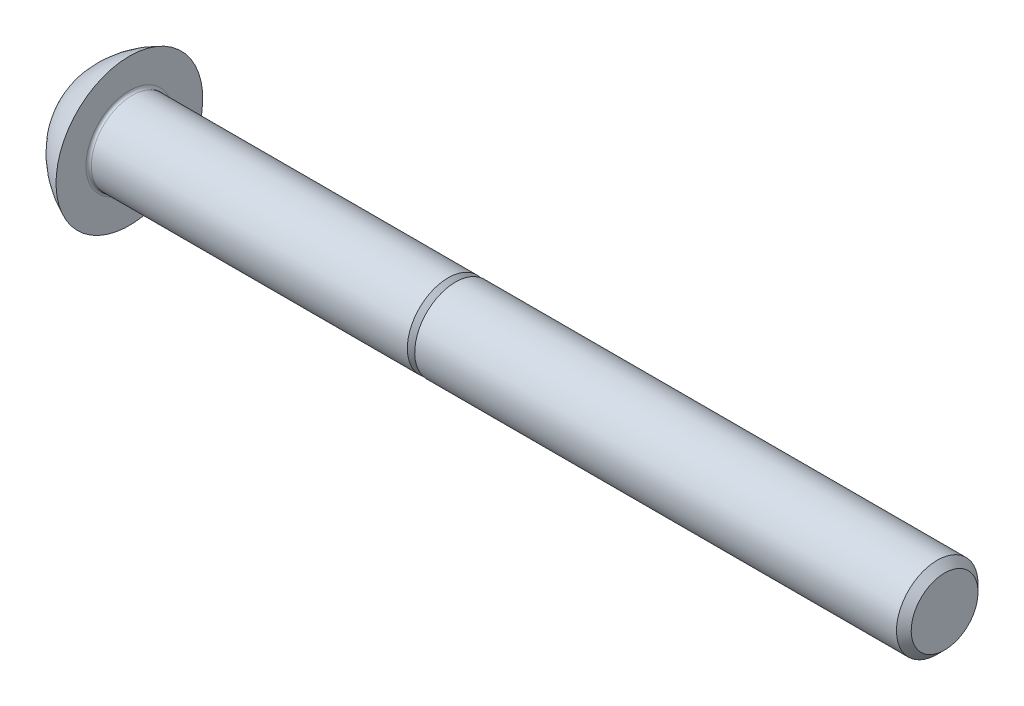
ISO-10303-21;
HEADER;
FILE_DESCRIPTION(('STEP AP214'),'2;1');
FILE_NAME('part.step','',(''),(''),'','','');
FILE_SCHEMA(('AUTOMOTIVE_DESIGN { 1 0 10303 214 1 1 1 1 }'));
ENDSEC;
DATA;
#1=APPLICATION_CONTEXT('core data for automotive mechanical design processes');
#2=APPLICATION_PROTOCOL_DEFINITION('international standard','automotive_design',2000,#1);
#3=PRODUCT_CONTEXT('',#1,'mechanical');
#4=PRODUCT('Part','Part','',(#3));
#5=PRODUCT_RELATED_PRODUCT_CATEGORY('part','',(#4));
#6=PRODUCT_DEFINITION_FORMATION('','',#4);
#7=PRODUCT_DEFINITION_CONTEXT('part definition',#1,'design');
#8=PRODUCT_DEFINITION('design','',#6,#7);
#9=PRODUCT_DEFINITION_SHAPE('','',#8);
#10=(LENGTH_UNIT() NAMED_UNIT(*) SI_UNIT(.MILLI.,.METRE.));
#11=(NAMED_UNIT(*) PLANE_ANGLE_UNIT() SI_UNIT($,.RADIAN.));
#12=(NAMED_UNIT(*) SI_UNIT($,.STERADIAN.) SOLID_ANGLE_UNIT());
#13=UNCERTAINTY_MEASURE_WITH_UNIT(LENGTH_MEASURE(1.E-05),#10,'distance_accuracy_value','');
#14=(GEOMETRIC_REPRESENTATION_CONTEXT(3) GLOBAL_UNCERTAINTY_ASSIGNED_CONTEXT((#13)) GLOBAL_UNIT_ASSIGNED_CONTEXT((#10,
#11,#12)) REPRESENTATION_CONTEXT('',''));
#15=CARTESIAN_POINT('',(0.,0.,0.));
#16=DIRECTION('',(0.,0.,1.));
#17=DIRECTION('',(1.,0.,0.));
#18=AXIS2_PLACEMENT_3D('',#15,#16,#17);
#19=CARTESIAN_POINT('',(-1.,-0.900666419935816,0.52));
#20=DIRECTION('',(0.,-0.866025403784439,0.5));
#21=DIRECTION('',(0.,-0.5,-0.866025403784439));
#22=AXIS2_PLACEMENT_3D('',#19,#20,#21);
#23=PLANE('',#22);
#24=DIRECTION('',(0.,-0.5,-0.866025403784439));
#25=VECTOR('',#24,1.);
#26=CARTESIAN_POINT('',(0.,-0.819416419935816,0.660729128114971));
#27=LINE('',#26,#25);
#28=CARTESIAN_POINT('',(0.,-0.600444279957211,1.04));
#29=VERTEX_POINT('',#28);
#30=CARTESIAN_POINT('',(0.,-1.20088855991442,0.));
#31=VERTEX_POINT('',#30);
#32=EDGE_CURVE('E37',#29,#31,#27,.T.);
#33=ORIENTED_EDGE('',*,*,#32,.F.);
#34=DIRECTION('',(1.,0.,0.));
#35=VECTOR('',#34,1.);
#36=CARTESIAN_POINT('',(-1.,-0.600444279957211,1.04));
#37=LINE('',#36,#35);
#38=CARTESIAN_POINT('',(1.04,-0.600444279957211,1.04));
#39=VERTEX_POINT('',#38);
#40=EDGE_CURVE('E11',#29,#39,#37,.T.);
#41=ORIENTED_EDGE('',*,*,#40,.T.);
#42=DIRECTION('',(0.,0.5,0.866025403784439));
#43=VECTOR('',#42,1.);
#44=CARTESIAN_POINT('',(1.04,-0.600444279957211,1.04));
#45=LINE('',#44,#43);
#46=CARTESIAN_POINT('',(1.04,-0.752876240745874,0.775980099216687));
#47=VERTEX_POINT('',#46);
#48=EDGE_CURVE('E213',#47,#39,#45,.T.);
#49=ORIENTED_EDGE('',*,*,#48,.F.);
#50=CARTESIAN_POINT('',(1.04,-0.752876240745875,0.775980099216688));
#51=CARTESIAN_POINT('',(1.03905947423286,-0.74357721040589,0.792086492226667));
#52=CARTESIAN_POINT('',(1.038,-0.73418518976256,0.808353949166648));
#53=(BOUNDED_CURVE() B_SPLINE_CURVE(2,(#50,#51,#52),.UNSPECIFIED.,.F.,
.F.) B_SPLINE_CURVE_WITH_KNOTS((3,3),(0.,0.0374356048378607),
.UNSPECIFIED.) CURVE() GEOMETRIC_REPRESENTATION_ITEM() RATIONAL_B_SPLINE_CURVE((1.,
1.00014797863071,1.)) REPRESENTATION_ITEM(''));
#54=CARTESIAN_POINT('',(1.038,-0.734185189762562,0.808353949166645));
#55=VERTEX_POINT('',#54);
#56=EDGE_CURVE('E29',#47,#55,#53,.T.);
#57=ORIENTED_EDGE('',*,*,#56,.T.);
#58=DIRECTION('',(0.,-0.5,-0.866025403784439));
#59=VECTOR('',#58,1.);
#60=CARTESIAN_POINT('',(1.038,-0.832416419935816,0.638212467616576));
#61=LINE('',#60,#59);
#62=CARTESIAN_POINT('',(1.038,-1.06714765010907,0.231646050833355));
#63=VERTEX_POINT('',#62);
#64=EDGE_CURVE('E232',#55,#63,#61,.T.);
#65=ORIENTED_EDGE('',*,*,#64,.T.);
#66=CARTESIAN_POINT('',(1.038,-1.06714765010907,0.231646050833352));
#67=CARTESIAN_POINT('',(1.03905947423286,-1.05775562946574,0.247913507773334));
#68=CARTESIAN_POINT('',(1.04,-1.04845659912576,0.264019900783313));
#69=(BOUNDED_CURVE() B_SPLINE_CURVE(2,(#66,#67,#68),.UNSPECIFIED.,.F.,
.F.) B_SPLINE_CURVE_WITH_KNOTS((3,3),(0.,0.0374356048378611),
.UNSPECIFIED.) CURVE() GEOMETRIC_REPRESENTATION_ITEM() RATIONAL_B_SPLINE_CURVE((1.,
1.00014797861765,1.)) REPRESENTATION_ITEM(''));
#70=CARTESIAN_POINT('',(1.04,-1.04845659912576,0.264019900783312));
#71=VERTEX_POINT('',#70);
#72=EDGE_CURVE('E173',#63,#71,#69,.T.);
#73=ORIENTED_EDGE('',*,*,#72,.T.);
#74=DIRECTION('',(0.,0.5,0.866025403784439));
#75=VECTOR('',#74,1.);
#76=CARTESIAN_POINT('',(1.04,-0.600444279957211,1.04));
#77=LINE('',#76,#75);
#78=CARTESIAN_POINT('',(1.04,-1.20088855991442,0.));
#79=VERTEX_POINT('',#78);
#80=EDGE_CURVE('E168',#79,#71,#77,.T.);
#81=ORIENTED_EDGE('',*,*,#80,.F.);
#82=DIRECTION('',(1.,0.,0.));
#83=VECTOR('',#82,1.);
#84=CARTESIAN_POINT('',(-1.,-1.20088855991442,0.));
#85=LINE('',#84,#83);
#86=EDGE_CURVE('E170',#31,#79,#85,.T.);
#87=ORIENTED_EDGE('',*,*,#86,.F.);
#88=EDGE_LOOP('',(#33,#41,#49,#57,#65,#73,#81,#87));
#89=FACE_BOUND('',#88,.T.);
#90=ADVANCED_FACE('F19',(#89),#23,.F.);
#91=CARTESIAN_POINT('',(-1.,-0.900666419935816,-0.52));
#92=DIRECTION('',(0.,-0.866025403784439,-0.5));
#93=DIRECTION('',(0.,0.5,-0.866025403784439));
#94=AXIS2_PLACEMENT_3D('',#91,#92,#93);
#95=PLANE('',#94);
#96=DIRECTION('',(0.,0.5,-0.866025403784439));
#97=VECTOR('',#96,1.);
#98=CARTESIAN_POINT('',(0.,-0.819416419935816,-0.660729128114971));
#99=LINE('',#98,#97);
#100=CARTESIAN_POINT('',(0.,-0.600444279957211,-1.04));
#101=VERTEX_POINT('',#100);
#102=EDGE_CURVE('E186',#31,#101,#99,.T.);
#103=ORIENTED_EDGE('',*,*,#102,.F.);
#104=ORIENTED_EDGE('',*,*,#86,.T.);
#105=DIRECTION('',(0.,-0.5,0.866025403784439));
#106=VECTOR('',#105,1.);
#107=CARTESIAN_POINT('',(1.04,-1.20088855991442,0.));
#108=LINE('',#107,#106);
#109=CARTESIAN_POINT('',(1.04,-1.04845659912576,-0.264019900783312));
#110=VERTEX_POINT('',#109);
#111=EDGE_CURVE('E178',#110,#79,#108,.T.);
#112=ORIENTED_EDGE('',*,*,#111,.F.);
#113=CARTESIAN_POINT('',(1.04,-1.04845659912576,-0.264019900783312));
#114=CARTESIAN_POINT('',(1.03905947423287,-1.05775562946569,-0.247913507773424));
#115=CARTESIAN_POINT('',(1.038,-1.06714765010907,-0.23164605083335));
#116=(BOUNDED_CURVE() B_SPLINE_CURVE(2,(#113,#114,#115),.UNSPECIFIED.,.F.,
.F.) B_SPLINE_CURVE_WITH_KNOTS((3,3),(0.,0.0374356048378617),
.UNSPECIFIED.) CURVE() GEOMETRIC_REPRESENTATION_ITEM() RATIONAL_B_SPLINE_CURVE((1.,
1.00014797862095,1.)) REPRESENTATION_ITEM(''));
#117=CARTESIAN_POINT('',(1.038,-1.06714765010907,-0.231646050833354));
#118=VERTEX_POINT('',#117);
#119=EDGE_CURVE('E187',#110,#118,#116,.T.);
#120=ORIENTED_EDGE('',*,*,#119,.T.);
#121=DIRECTION('',(0.,0.5,-0.866025403784439));
#122=VECTOR('',#121,1.);
#123=CARTESIAN_POINT('',(1.038,-0.832416419935816,-0.638212467616576));
#124=LINE('',#123,#122);
#125=CARTESIAN_POINT('',(1.038,-0.734185189762562,-0.808353949166645));
#126=VERTEX_POINT('',#125);
#127=EDGE_CURVE('E348',#118,#126,#124,.T.);
#128=ORIENTED_EDGE('',*,*,#127,.T.);
#129=CARTESIAN_POINT('',(1.038,-0.734185189762559,-0.808353949166649));
#130=CARTESIAN_POINT('',(1.03905947423287,-0.743577210405941,-0.792086492226576));
#131=CARTESIAN_POINT('',(1.04,-0.752876240745874,-0.775980099216688));
#132=(BOUNDED_CURVE() B_SPLINE_CURVE(2,(#129,#130,#131),.UNSPECIFIED.,.F.,
.F.) B_SPLINE_CURVE_WITH_KNOTS((3,3),(0.,0.0374356048378615),
.UNSPECIFIED.) CURVE() GEOMETRIC_REPRESENTATION_ITEM() RATIONAL_B_SPLINE_CURVE((1.,
1.00014797861121,1.)) REPRESENTATION_ITEM(''));
#133=CARTESIAN_POINT('',(1.04,-0.752876240745874,-0.775980099216688));
#134=VERTEX_POINT('',#133);
#135=EDGE_CURVE('E318',#126,#134,#132,.T.);
#136=ORIENTED_EDGE('',*,*,#135,.T.);
#137=DIRECTION('',(0.,-0.5,0.866025403784439));
#138=VECTOR('',#137,1.);
#139=CARTESIAN_POINT('',(1.04,-1.20088855991442,0.));
#140=LINE('',#139,#138);
#141=CARTESIAN_POINT('',(1.04,-0.600444279957211,-1.04));
#142=VERTEX_POINT('',#141);
#143=EDGE_CURVE('E192',#142,#134,#140,.T.);
#144=ORIENTED_EDGE('',*,*,#143,.F.);
#145=DIRECTION('',(1.,0.,0.));
#146=VECTOR('',#145,1.);
#147=CARTESIAN_POINT('',(-1.,-0.600444279957211,-1.04));
#148=LINE('',#147,#146);
#149=EDGE_CURVE('E315',#101,#142,#148,.T.);
#150=ORIENTED_EDGE('',*,*,#149,.F.);
#151=EDGE_LOOP('',(#103,#104,#112,#120,#128,#136,#144,#150));
#152=FACE_BOUND('',#151,.T.);
#153=ADVANCED_FACE('F182',(#152),#95,.F.);
#154=CARTESIAN_POINT('',(-1.,0.,-1.04));
#155=DIRECTION('',(0.,0.,-1.));
#156=DIRECTION('',(0.,1.,0.));
#157=AXIS2_PLACEMENT_3D('',#154,#155,#156);
#158=PLANE('',#157);
#159=DIRECTION('',(0.,1.,0.));
#160=VECTOR('',#159,1.);
#161=CARTESIAN_POINT('',(0.,0.325,-1.04));
#162=LINE('',#161,#160);
#163=CARTESIAN_POINT('',(0.,0.60044427995721,-1.04));
#164=VERTEX_POINT('',#163);
#165=EDGE_CURVE('E312',#101,#164,#162,.T.);
#166=ORIENTED_EDGE('',*,*,#165,.F.);
#167=ORIENTED_EDGE('',*,*,#149,.T.);
#168=DIRECTION('',(0.,-1.,0.));
#169=VECTOR('',#168,1.);
#170=CARTESIAN_POINT('',(1.04,-0.600444279957211,-1.04));
#171=LINE('',#170,#169);
#172=CARTESIAN_POINT('',(1.04,-0.295580358379884,-1.04));
#173=VERTEX_POINT('',#172);
#174=EDGE_CURVE('E262',#173,#142,#171,.T.);
#175=ORIENTED_EDGE('',*,*,#174,.F.);
#176=CARTESIAN_POINT('',(1.04,-0.295580358379884,-1.04));
#177=CARTESIAN_POINT('',(1.03905947423286,-0.314178419059819,-1.04));
#178=CARTESIAN_POINT('',(1.038,-0.332962460346514,-1.04));
#179=(BOUNDED_CURVE() B_SPLINE_CURVE(2,(#176,#177,#178),.UNSPECIFIED.,.F.,
.F.) B_SPLINE_CURVE_WITH_KNOTS((3,3),(0.,0.0374356048378617),
.UNSPECIFIED.) CURVE() GEOMETRIC_REPRESENTATION_ITEM() RATIONAL_B_SPLINE_CURVE((1.,
1.00014797861979,1.)) REPRESENTATION_ITEM(''));
#180=CARTESIAN_POINT('',(1.038,-0.332962460346509,-1.04));
#181=VERTEX_POINT('',#180);
#182=EDGE_CURVE('E319',#173,#181,#179,.T.);
#183=ORIENTED_EDGE('',*,*,#182,.T.);
#184=DIRECTION('',(0.,1.,0.));
#185=VECTOR('',#184,1.);
#186=CARTESIAN_POINT('',(1.038,0.273,-1.04));
#187=LINE('',#186,#185);
#188=CARTESIAN_POINT('',(1.038,0.332962460346509,-1.04));
#189=VERTEX_POINT('',#188);
#190=EDGE_CURVE('E294',#181,#189,#187,.T.);
#191=ORIENTED_EDGE('',*,*,#190,.T.);
#192=CARTESIAN_POINT('',(1.038,0.332962460346514,-1.04));
#193=CARTESIAN_POINT('',(1.03905947423286,0.314178419059819,-1.04));
#194=CARTESIAN_POINT('',(1.04,0.295580358379884,-1.04));
#195=(BOUNDED_CURVE() B_SPLINE_CURVE(2,(#192,#193,#194),.UNSPECIFIED.,.F.,
.F.) B_SPLINE_CURVE_WITH_KNOTS((3,3),(0.,0.0374356048378617),
.UNSPECIFIED.) CURVE() GEOMETRIC_REPRESENTATION_ITEM() RATIONAL_B_SPLINE_CURVE((1.,
1.00014797861979,1.)) REPRESENTATION_ITEM(''));
#196=CARTESIAN_POINT('',(1.04,0.295580358379884,-1.04));
#197=VERTEX_POINT('',#196);
#198=EDGE_CURVE('E218',#189,#197,#195,.T.);
#199=ORIENTED_EDGE('',*,*,#198,.T.);
#200=DIRECTION('',(0.,-1.,0.));
#201=VECTOR('',#200,1.);
#202=CARTESIAN_POINT('',(1.04,-0.600444279957211,-1.04));
#203=LINE('',#202,#201);
#204=CARTESIAN_POINT('',(1.04,0.60044427995721,-1.04));
#205=VERTEX_POINT('',#204);
#206=EDGE_CURVE('E23',#205,#197,#203,.T.);
#207=ORIENTED_EDGE('',*,*,#206,.F.);
#208=DIRECTION('',(1.,0.,0.));
#209=VECTOR('',#208,1.);
#210=CARTESIAN_POINT('',(-1.,0.60044427995721,-1.04));
#211=LINE('',#210,#209);
#212=EDGE_CURVE('E215',#164,#205,#211,.T.);
#213=ORIENTED_EDGE('',*,*,#212,.F.);
#214=EDGE_LOOP('',(#166,#167,#175,#183,#191,#199,#207,#213));
#215=FACE_BOUND('',#214,.T.);
#216=ADVANCED_FACE('F429',(#215),#158,.F.);
#217=CARTESIAN_POINT('',(-1.,0.900666419935816,-0.52));
#218=DIRECTION('',(0.,0.866025403784439,-0.5));
#219=DIRECTION('',(0.,0.5,0.866025403784439));
#220=AXIS2_PLACEMENT_3D('',#217,#218,#219);
#221=PLANE('',#220);
#222=DIRECTION('',(0.,0.5,0.866025403784439));
#223=VECTOR('',#222,1.);
#224=CARTESIAN_POINT('',(0.,0.981916419935816,-0.379270871885029));
#225=LINE('',#224,#223);
#226=CARTESIAN_POINT('',(0.,1.20088855991442,0.));
#227=VERTEX_POINT('',#226);
#228=EDGE_CURVE('E205',#164,#227,#225,.T.);
#229=ORIENTED_EDGE('',*,*,#228,.F.);
#230=ORIENTED_EDGE('',*,*,#212,.T.);
#231=DIRECTION('',(0.,-0.5,-0.866025403784439));
#232=VECTOR('',#231,1.);
#233=CARTESIAN_POINT('',(1.04,0.60044427995721,-1.04));
#234=LINE('',#233,#232);
#235=CARTESIAN_POINT('',(1.04,0.752876240745874,-0.775980099216688));
#236=VERTEX_POINT('',#235);
#237=EDGE_CURVE('E308',#236,#205,#234,.T.);
#238=ORIENTED_EDGE('',*,*,#237,.F.);
#239=CARTESIAN_POINT('',(1.04,0.752876240745876,-0.775980099216684));
#240=CARTESIAN_POINT('',(1.03905947423287,0.743577210405964,-0.792086492226539));
#241=CARTESIAN_POINT('',(1.038,0.734185189762562,-0.808353949166644));
#242=(BOUNDED_CURVE() B_SPLINE_CURVE(2,(#239,#240,#241),.UNSPECIFIED.,.F.,
.F.) B_SPLINE_CURVE_WITH_KNOTS((3,3),(0.,0.037435604837859),
.UNSPECIFIED.) CURVE() GEOMETRIC_REPRESENTATION_ITEM() RATIONAL_B_SPLINE_CURVE((1.,
1.00014797875194,1.)) REPRESENTATION_ITEM(''));
#243=CARTESIAN_POINT('',(1.038,0.734185189762561,-0.808353949166646));
#244=VERTEX_POINT('',#243);
#245=EDGE_CURVE('E219',#236,#244,#242,.T.);
#246=ORIENTED_EDGE('',*,*,#245,.T.);
#247=DIRECTION('',(0.,0.5,0.866025403784439));
#248=VECTOR('',#247,1.);
#249=CARTESIAN_POINT('',(1.038,0.968916419935816,-0.401787532383424));
#250=LINE('',#249,#248);
#251=CARTESIAN_POINT('',(1.038,1.06714765010907,-0.231646050833355));
#252=VERTEX_POINT('',#251);
#253=EDGE_CURVE('E203',#244,#252,#250,.T.);
#254=ORIENTED_EDGE('',*,*,#253,.T.);
#255=CARTESIAN_POINT('',(1.038,1.06714765010907,-0.231646050833356));
#256=CARTESIAN_POINT('',(1.03905947423287,1.05775562946567,-0.247913507773464));
#257=CARTESIAN_POINT('',(1.04,1.04845659912575,-0.264019900783316));
#258=(BOUNDED_CURVE() B_SPLINE_CURVE(2,(#255,#256,#257),.UNSPECIFIED.,.F.,
.F.) B_SPLINE_CURVE_WITH_KNOTS((3,3),(0.,0.037435604837859),
.UNSPECIFIED.) CURVE() GEOMETRIC_REPRESENTATION_ITEM() RATIONAL_B_SPLINE_CURVE((1.,
1.00014797874819,1.)) REPRESENTATION_ITEM(''));
#259=CARTESIAN_POINT('',(1.04,1.04845659912576,-0.264019900783312));
#260=VERTEX_POINT('',#259);
#261=EDGE_CURVE('E198',#252,#260,#258,.T.);
#262=ORIENTED_EDGE('',*,*,#261,.T.);
#263=DIRECTION('',(0.,-0.5,-0.866025403784439));
#264=VECTOR('',#263,1.);
#265=CARTESIAN_POINT('',(1.04,0.60044427995721,-1.04));
#266=LINE('',#265,#264);
#267=CARTESIAN_POINT('',(1.04,1.20088855991442,0.));
#268=VERTEX_POINT('',#267);
#269=EDGE_CURVE('E226',#268,#260,#266,.T.);
#270=ORIENTED_EDGE('',*,*,#269,.F.);
#271=DIRECTION('',(1.,0.,0.));
#272=VECTOR('',#271,1.);
#273=CARTESIAN_POINT('',(-1.,1.20088855991442,0.));
#274=LINE('',#273,#272);
#275=EDGE_CURVE('E275',#227,#268,#274,.T.);
#276=ORIENTED_EDGE('',*,*,#275,.F.);
#277=EDGE_LOOP('',(#229,#230,#238,#246,#254,#262,#270,#276));
#278=FACE_BOUND('',#277,.T.);
#279=ADVANCED_FACE('F433',(#278),#221,.F.);
#280=CARTESIAN_POINT('',(1.04,0.,0.));
#281=DIRECTION('',(1.,0.,0.));
#282=DIRECTION('',(0.,0.,-1.));
#283=AXIS2_PLACEMENT_3D('',#280,#281,#282);
#284=PLANE('',#283);
#285=CARTESIAN_POINT('',(1.04,0.,0.));
#286=DIRECTION('',(1.,0.,0.));
#287=DIRECTION('',(0.,1.,0.));
#288=AXIS2_PLACEMENT_3D('',#285,#286,#287);
#289=CIRCLE('',#288,1.08118811881188);
#290=EDGE_CURVE('E204',#197,#236,#289,.T.);
#291=ORIENTED_EDGE('',*,*,#290,.T.);
#292=ORIENTED_EDGE('',*,*,#237,.T.);
#293=ORIENTED_EDGE('',*,*,#206,.T.);
#294=EDGE_LOOP('',(#291,#292,#293));
#295=FACE_BOUND('',#294,.T.);
#296=ADVANCED_FACE('F451',(#295),#284,.F.);
#297=CARTESIAN_POINT('',(1.04,0.,0.));
#298=DIRECTION('',(1.,0.,0.));
#299=DIRECTION('',(0.,0.,-1.));
#300=AXIS2_PLACEMENT_3D('',#297,#298,#299);
#301=PLANE('',#300);
#302=CARTESIAN_POINT('',(1.04,0.,0.));
#303=DIRECTION('',(1.,0.,0.));
#304=DIRECTION('',(0.,1.,0.));
#305=AXIS2_PLACEMENT_3D('',#302,#303,#304);
#306=CIRCLE('',#305,1.08118811881188);
#307=EDGE_CURVE('E309',#134,#173,#306,.T.);
#308=ORIENTED_EDGE('',*,*,#307,.T.);
#309=ORIENTED_EDGE('',*,*,#174,.T.);
#310=ORIENTED_EDGE('',*,*,#143,.T.);
#311=EDGE_LOOP('',(#308,#309,#310));
#312=FACE_BOUND('',#311,.T.);
#313=ADVANCED_FACE('F458',(#312),#301,.F.);
#314=CARTESIAN_POINT('',(1.04,0.,0.));
#315=DIRECTION('',(1.,0.,0.));
#316=DIRECTION('',(0.,0.,-1.));
#317=AXIS2_PLACEMENT_3D('',#314,#315,#316);
#318=PLANE('',#317);
#319=CARTESIAN_POINT('',(1.04,0.,0.));
#320=DIRECTION('',(1.,0.,0.));
#321=DIRECTION('',(0.,1.,0.));
#322=AXIS2_PLACEMENT_3D('',#319,#320,#321);
#323=CIRCLE('',#322,1.08118811881188);
#324=EDGE_CURVE('E190',#71,#110,#323,.T.);
#325=ORIENTED_EDGE('',*,*,#324,.T.);
#326=ORIENTED_EDGE('',*,*,#111,.T.);
#327=ORIENTED_EDGE('',*,*,#80,.T.);
#328=EDGE_LOOP('',(#325,#326,#327));
#329=FACE_BOUND('',#328,.T.);
#330=ADVANCED_FACE('F189',(#329),#318,.F.);
#331=CARTESIAN_POINT('',(1.04,0.,0.));
#332=DIRECTION('',(1.,0.,0.));
#333=DIRECTION('',(0.,0.,-1.));
#334=AXIS2_PLACEMENT_3D('',#331,#332,#333);
#335=PLANE('',#334);
#336=CARTESIAN_POINT('',(1.04,0.,0.));
#337=DIRECTION('',(1.,0.,0.));
#338=DIRECTION('',(0.,1.,0.));
#339=AXIS2_PLACEMENT_3D('',#336,#337,#338);
#340=CIRCLE('',#339,1.08118811881188);
#341=CARTESIAN_POINT('',(1.04,-0.295580358379883,1.04));
#342=VERTEX_POINT('',#341);
#343=EDGE_CURVE('E179',#342,#47,#340,.T.);
#344=ORIENTED_EDGE('',*,*,#343,.T.);
#345=ORIENTED_EDGE('',*,*,#48,.T.);
#346=DIRECTION('',(0.,1.,0.));
#347=VECTOR('',#346,1.);
#348=CARTESIAN_POINT('',(1.04,0.600444279957211,1.04));
#349=LINE('',#348,#347);
#350=EDGE_CURVE('E220',#39,#342,#349,.T.);
#351=ORIENTED_EDGE('',*,*,#350,.T.);
#352=EDGE_LOOP('',(#344,#345,#351));
#353=FACE_BOUND('',#352,.T.);
#354=ADVANCED_FACE('F413',(#353),#335,.F.);
#355=CARTESIAN_POINT('',(1.04,0.,0.));
#356=DIRECTION('',(1.,0.,0.));
#357=DIRECTION('',(0.,0.,-1.));
#358=AXIS2_PLACEMENT_3D('',#355,#356,#357);
#359=PLANE('',#358);
#360=CARTESIAN_POINT('',(1.04,0.,0.));
#361=DIRECTION('',(1.,0.,0.));
#362=DIRECTION('',(0.,1.,0.));
#363=AXIS2_PLACEMENT_3D('',#360,#361,#362);
#364=CIRCLE('',#363,1.08118811881188);
#365=CARTESIAN_POINT('',(1.04,0.752876240745875,0.775980099216687));
#366=VERTEX_POINT('',#365);
#367=CARTESIAN_POINT('',(1.04,0.295580358379884,1.04));
#368=VERTEX_POINT('',#367);
#369=EDGE_CURVE('E221',#366,#368,#364,.T.);
#370=ORIENTED_EDGE('',*,*,#369,.T.);
#371=DIRECTION('',(0.,1.,0.));
#372=VECTOR('',#371,1.);
#373=CARTESIAN_POINT('',(1.04,0.600444279957211,1.04));
#374=LINE('',#373,#372);
#375=CARTESIAN_POINT('',(1.04,0.600444279957211,1.04));
#376=VERTEX_POINT('',#375);
#377=EDGE_CURVE('E260',#368,#376,#374,.T.);
#378=ORIENTED_EDGE('',*,*,#377,.T.);
#379=DIRECTION('',(0.,0.5,-0.866025403784439));
#380=VECTOR('',#379,1.);
#381=CARTESIAN_POINT('',(1.04,1.20088855991442,0.));
#382=LINE('',#381,#380);
#383=EDGE_CURVE('E342',#376,#366,#382,.T.);
#384=ORIENTED_EDGE('',*,*,#383,.T.);
#385=EDGE_LOOP('',(#370,#378,#384));
#386=FACE_BOUND('',#385,.T.);
#387=ADVANCED_FACE('F438',(#386),#359,.F.);
#388=CARTESIAN_POINT('',(1.04,0.,0.));
#389=DIRECTION('',(1.,0.,0.));
#390=DIRECTION('',(0.,0.,-1.));
#391=AXIS2_PLACEMENT_3D('',#388,#389,#390);
#392=PLANE('',#391);
#393=CARTESIAN_POINT('',(1.04,0.,0.));
#394=DIRECTION('',(1.,0.,0.));
#395=DIRECTION('',(0.,1.,0.));
#396=AXIS2_PLACEMENT_3D('',#393,#394,#395);
#397=CIRCLE('',#396,1.08118811881188);
#398=CARTESIAN_POINT('',(1.04,1.04845659912576,0.264019900783312));
#399=VERTEX_POINT('',#398);
#400=EDGE_CURVE('E332',#260,#399,#397,.T.);
#401=ORIENTED_EDGE('',*,*,#400,.T.);
#402=DIRECTION('',(0.,0.5,-0.866025403784439));
#403=VECTOR('',#402,1.);
#404=CARTESIAN_POINT('',(1.04,1.20088855991442,0.));
#405=LINE('',#404,#403);
#406=EDGE_CURVE('E329',#399,#268,#405,.T.);
#407=ORIENTED_EDGE('',*,*,#406,.T.);
#408=ORIENTED_EDGE('',*,*,#269,.T.);
#409=EDGE_LOOP('',(#401,#407,#408));
#410=FACE_BOUND('',#409,.T.);
#411=ADVANCED_FACE('F445',(#410),#392,.F.);
#412=CARTESIAN_POINT('',(-1.,0.,1.04));
#413=DIRECTION('',(0.,0.,1.));
#414=DIRECTION('',(0.,-1.,0.));
#415=AXIS2_PLACEMENT_3D('',#412,#413,#414);
#416=PLANE('',#415);
#417=DIRECTION('',(0.,-1.,0.));
#418=VECTOR('',#417,1.);
#419=CARTESIAN_POINT('',(0.,0.325,1.04));
#420=LINE('',#419,#418);
#421=CARTESIAN_POINT('',(0.,0.600444279957211,1.04));
#422=VERTEX_POINT('',#421);
#423=EDGE_CURVE('E257',#422,#29,#420,.T.);
#424=ORIENTED_EDGE('',*,*,#423,.F.);
#425=DIRECTION('',(1.,0.,0.));
#426=VECTOR('',#425,1.);
#427=CARTESIAN_POINT('',(-1.,0.600444279957211,1.04));
#428=LINE('',#427,#426);
#429=EDGE_CURVE('E223',#422,#376,#428,.T.);
#430=ORIENTED_EDGE('',*,*,#429,.T.);
#431=ORIENTED_EDGE('',*,*,#377,.F.);
#432=CARTESIAN_POINT('',(1.04,0.295580358379885,1.04));
#433=CARTESIAN_POINT('',(1.03905947423286,0.314178419059821,1.04));
#434=CARTESIAN_POINT('',(1.038,0.332962460346514,1.04));
#435=(BOUNDED_CURVE() B_SPLINE_CURVE(2,(#432,#433,#434),.UNSPECIFIED.,.F.,
.F.) B_SPLINE_CURVE_WITH_KNOTS((3,3),(0.,0.0374356048378608),
.UNSPECIFIED.) CURVE() GEOMETRIC_REPRESENTATION_ITEM() RATIONAL_B_SPLINE_CURVE((1.,
1.0001479786181,1.)) REPRESENTATION_ITEM(''));
#436=CARTESIAN_POINT('',(1.038,0.33296246034651,1.04));
#437=VERTEX_POINT('',#436);
#438=EDGE_CURVE('E227',#368,#437,#435,.T.);
#439=ORIENTED_EDGE('',*,*,#438,.T.);
#440=DIRECTION('',(0.,-1.,0.));
#441=VECTOR('',#440,1.);
#442=CARTESIAN_POINT('',(1.038,0.273,1.04));
#443=LINE('',#442,#441);
#444=CARTESIAN_POINT('',(1.038,-0.33296246034651,1.04));
#445=VERTEX_POINT('',#444);
#446=EDGE_CURVE('E274',#437,#445,#443,.T.);
#447=ORIENTED_EDGE('',*,*,#446,.T.);
#448=CARTESIAN_POINT('',(1.038,-0.332962460346514,1.04));
#449=CARTESIAN_POINT('',(1.03905947423286,-0.314178419059821,1.04));
#450=CARTESIAN_POINT('',(1.04,-0.295580358379885,1.04));
#451=(BOUNDED_CURVE() B_SPLINE_CURVE(2,(#448,#449,#450),.UNSPECIFIED.,.F.,
.F.) B_SPLINE_CURVE_WITH_KNOTS((3,3),(0.,0.0374356048378608),
.UNSPECIFIED.) CURVE() GEOMETRIC_REPRESENTATION_ITEM() RATIONAL_B_SPLINE_CURVE((1.,
1.00014797862319,1.)) REPRESENTATION_ITEM(''));
#452=EDGE_CURVE('E269',#445,#342,#451,.T.);
#453=ORIENTED_EDGE('',*,*,#452,.T.);
#454=ORIENTED_EDGE('',*,*,#350,.F.);
#455=ORIENTED_EDGE('',*,*,#40,.F.);
#456=EDGE_LOOP('',(#424,#430,#431,#439,#447,#453,#454,#455));
#457=FACE_BOUND('',#456,.T.);
#458=ADVANCED_FACE('F398',(#457),#416,.F.);
#459=CARTESIAN_POINT('',(-1.,0.900666419935816,0.52));
#460=DIRECTION('',(0.,0.866025403784439,0.5));
#461=DIRECTION('',(0.,-0.5,0.866025403784439));
#462=AXIS2_PLACEMENT_3D('',#459,#460,#461);
#463=PLANE('',#462);
#464=DIRECTION('',(0.,-0.5,0.866025403784439));
#465=VECTOR('',#464,1.);
#466=CARTESIAN_POINT('',(0.,0.981916419935816,0.379270871885029));
#467=LINE('',#466,#465);
#468=EDGE_CURVE('E211',#227,#422,#467,.T.);
#469=ORIENTED_EDGE('',*,*,#468,.F.);
#470=ORIENTED_EDGE('',*,*,#275,.T.);
#471=ORIENTED_EDGE('',*,*,#406,.F.);
#472=CARTESIAN_POINT('',(1.04,1.04845659912576,0.264019900783313));
#473=CARTESIAN_POINT('',(1.03905947423286,1.05775562946574,0.247913507773334));
#474=CARTESIAN_POINT('',(1.038,1.06714765010907,0.231646050833351));
#475=(BOUNDED_CURVE() B_SPLINE_CURVE(2,(#472,#473,#474),.UNSPECIFIED.,.F.,
.F.) B_SPLINE_CURVE_WITH_KNOTS((3,3),(0.,0.0374356048378618),
.UNSPECIFIED.) CURVE() GEOMETRIC_REPRESENTATION_ITEM() RATIONAL_B_SPLINE_CURVE((1.,
1.00014797861721,1.)) REPRESENTATION_ITEM(''));
#476=CARTESIAN_POINT('',(1.038,1.06714765010907,0.231646050833354));
#477=VERTEX_POINT('',#476);
#478=EDGE_CURVE('E304',#399,#477,#475,.T.);
#479=ORIENTED_EDGE('',*,*,#478,.T.);
#480=DIRECTION('',(0.,-0.5,0.866025403784439));
#481=VECTOR('',#480,1.);
#482=CARTESIAN_POINT('',(1.038,0.968916419935816,0.401787532383424));
#483=LINE('',#482,#481);
#484=CARTESIAN_POINT('',(1.038,0.734185189762563,0.808353949166645));
#485=VERTEX_POINT('',#484);
#486=EDGE_CURVE('E283',#477,#485,#483,.T.);
#487=ORIENTED_EDGE('',*,*,#486,.T.);
#488=CARTESIAN_POINT('',(1.038,0.734185189762561,0.808353949166648));
#489=CARTESIAN_POINT('',(1.03905947423286,0.743577210405889,0.792086492226667));
#490=CARTESIAN_POINT('',(1.04,0.752876240745875,0.775980099216687));
#491=(BOUNDED_CURVE() B_SPLINE_CURVE(2,(#488,#489,#490),.UNSPECIFIED.,.F.,
.F.) B_SPLINE_CURVE_WITH_KNOTS((3,3),(0.,0.0374356048378615),
.UNSPECIFIED.) CURVE() GEOMETRIC_REPRESENTATION_ITEM() RATIONAL_B_SPLINE_CURVE((1.,
1.00014797861975,1.)) REPRESENTATION_ITEM(''));
#492=EDGE_CURVE('E244',#485,#366,#491,.T.);
#493=ORIENTED_EDGE('',*,*,#492,.T.);
#494=ORIENTED_EDGE('',*,*,#383,.F.);
#495=ORIENTED_EDGE('',*,*,#429,.F.);
#496=EDGE_LOOP('',(#469,#470,#471,#479,#487,#493,#494,#495));
#497=FACE_BOUND('',#496,.T.);
#498=ADVANCED_FACE('F436',(#497),#463,.F.);
#499=CARTESIAN_POINT('',(1.038,0.546,0.));
#500=DIRECTION('',(-1.,0.,0.));
#501=DIRECTION('',(0.,-1.,0.));
#502=AXIS2_PLACEMENT_3D('',#499,#500,#501);
#503=PLANE('',#502);
#504=ORIENTED_EDGE('',*,*,#446,.F.);
#505=CARTESIAN_POINT('',(1.038,0.,0.));
#506=DIRECTION('',(1.,0.,0.));
#507=DIRECTION('',(0.,1.,0.));
#508=AXIS2_PLACEMENT_3D('',#505,#506,#507);
#509=CIRCLE('',#508,1.092);
#510=EDGE_CURVE('E241',#437,#445,#509,.T.);
#511=ORIENTED_EDGE('',*,*,#510,.T.);
#512=EDGE_LOOP('',(#504,#511));
#513=FACE_BOUND('',#512,.T.);
#514=ADVANCED_FACE('F403',(#513),#503,.F.);
#515=CARTESIAN_POINT('',(1.038,0.546,0.));
#516=DIRECTION('',(-1.,0.,0.));
#517=DIRECTION('',(0.,-1.,0.));
#518=AXIS2_PLACEMENT_3D('',#515,#516,#517);
#519=PLANE('',#518);
#520=ORIENTED_EDGE('',*,*,#64,.F.);
#521=CARTESIAN_POINT('',(1.038,0.,0.));
#522=DIRECTION('',(1.,0.,0.));
#523=DIRECTION('',(0.,1.,0.));
#524=AXIS2_PLACEMENT_3D('',#521,#522,#523);
#525=CIRCLE('',#524,1.092);
#526=EDGE_CURVE('E245',#55,#63,#525,.T.);
#527=ORIENTED_EDGE('',*,*,#526,.T.);
#528=EDGE_LOOP('',(#520,#527));
#529=FACE_BOUND('',#528,.T.);
#530=ADVANCED_FACE('F463',(#529),#519,.F.);
#531=CARTESIAN_POINT('',(1.038,0.546,0.));
#532=DIRECTION('',(-1.,0.,0.));
#533=DIRECTION('',(0.,-1.,0.));
#534=AXIS2_PLACEMENT_3D('',#531,#532,#533);
#535=PLANE('',#534);
#536=ORIENTED_EDGE('',*,*,#127,.F.);
#537=CARTESIAN_POINT('',(1.038,0.,0.));
#538=DIRECTION('',(1.,0.,0.));
#539=DIRECTION('',(0.,1.,0.));
#540=AXIS2_PLACEMENT_3D('',#537,#538,#539);
#541=CIRCLE('',#540,1.092);
#542=EDGE_CURVE('E248',#118,#126,#541,.T.);
#543=ORIENTED_EDGE('',*,*,#542,.T.);
#544=EDGE_LOOP('',(#536,#543));
#545=FACE_BOUND('',#544,.T.);
#546=ADVANCED_FACE('F461',(#545),#535,.F.);
#547=CARTESIAN_POINT('',(1.038,0.546,0.));
#548=DIRECTION('',(-1.,0.,0.));
#549=DIRECTION('',(0.,-1.,0.));
#550=AXIS2_PLACEMENT_3D('',#547,#548,#549);
#551=PLANE('',#550);
#552=ORIENTED_EDGE('',*,*,#190,.F.);
#553=CARTESIAN_POINT('',(1.038,0.,0.));
#554=DIRECTION('',(1.,0.,0.));
#555=DIRECTION('',(0.,1.,0.));
#556=AXIS2_PLACEMENT_3D('',#553,#554,#555);
#557=CIRCLE('',#556,1.092);
#558=EDGE_CURVE('E252',#181,#189,#557,.T.);
#559=ORIENTED_EDGE('',*,*,#558,.T.);
#560=EDGE_LOOP('',(#552,#559));
#561=FACE_BOUND('',#560,.T.);
#562=ADVANCED_FACE('F456',(#561),#551,.F.);
#563=CARTESIAN_POINT('',(1.038,0.546,0.));
#564=DIRECTION('',(-1.,0.,0.));
#565=DIRECTION('',(0.,-1.,0.));
#566=AXIS2_PLACEMENT_3D('',#563,#564,#565);
#567=PLANE('',#566);
#568=ORIENTED_EDGE('',*,*,#253,.F.);
#569=CARTESIAN_POINT('',(1.038,0.,0.));
#570=DIRECTION('',(1.,0.,0.));
#571=DIRECTION('',(0.,1.,0.));
#572=AXIS2_PLACEMENT_3D('',#569,#570,#571);
#573=CIRCLE('',#572,1.092);
#574=EDGE_CURVE('E249',#244,#252,#573,.T.);
#575=ORIENTED_EDGE('',*,*,#574,.T.);
#576=EDGE_LOOP('',(#568,#575));
#577=FACE_BOUND('',#576,.T.);
#578=ADVANCED_FACE('F448',(#577),#567,.F.);
#579=CARTESIAN_POINT('',(1.038,0.546,0.));
#580=DIRECTION('',(-1.,0.,0.));
#581=DIRECTION('',(0.,-1.,0.));
#582=AXIS2_PLACEMENT_3D('',#579,#580,#581);
#583=PLANE('',#582);
#584=ORIENTED_EDGE('',*,*,#486,.F.);
#585=CARTESIAN_POINT('',(1.038,0.,0.));
#586=DIRECTION('',(1.,0.,0.));
#587=DIRECTION('',(0.,1.,0.));
#588=AXIS2_PLACEMENT_3D('',#585,#586,#587);
#589=CIRCLE('',#588,1.092);
#590=EDGE_CURVE('E210',#477,#485,#589,.T.);
#591=ORIENTED_EDGE('',*,*,#590,.T.);
#592=EDGE_LOOP('',(#584,#591));
#593=FACE_BOUND('',#592,.T.);
#594=ADVANCED_FACE('F441',(#593),#583,.F.);
#595=CARTESIAN_POINT('',(1.139,0.,0.));
#596=DIRECTION('',(-1.,0.,0.));
#597=DIRECTION('',(0.,1.,0.));
#598=AXIS2_PLACEMENT_3D('',#595,#596,#597);
#599=CONICAL_SURFACE('',#598,0.546,1.38788226954824);
#600=ORIENTED_EDGE('',*,*,#478,.F.);
#601=ORIENTED_EDGE('',*,*,#400,.F.);
#602=ORIENTED_EDGE('',*,*,#261,.F.);
#603=ORIENTED_EDGE('',*,*,#574,.F.);
#604=ORIENTED_EDGE('',*,*,#245,.F.);
#605=ORIENTED_EDGE('',*,*,#290,.F.);
#606=ORIENTED_EDGE('',*,*,#198,.F.);
#607=ORIENTED_EDGE('',*,*,#558,.F.);
#608=ORIENTED_EDGE('',*,*,#182,.F.);
#609=ORIENTED_EDGE('',*,*,#307,.F.);
#610=ORIENTED_EDGE('',*,*,#135,.F.);
#611=ORIENTED_EDGE('',*,*,#542,.F.);
#612=ORIENTED_EDGE('',*,*,#119,.F.);
#613=ORIENTED_EDGE('',*,*,#324,.F.);
#614=ORIENTED_EDGE('',*,*,#72,.F.);
#615=ORIENTED_EDGE('',*,*,#526,.F.);
#616=ORIENTED_EDGE('',*,*,#56,.F.);
#617=ORIENTED_EDGE('',*,*,#343,.F.);
#618=ORIENTED_EDGE('',*,*,#452,.F.);
#619=ORIENTED_EDGE('',*,*,#510,.F.);
#620=ORIENTED_EDGE('',*,*,#438,.F.);
#621=ORIENTED_EDGE('',*,*,#369,.F.);
#622=ORIENTED_EDGE('',*,*,#492,.F.);
#623=ORIENTED_EDGE('',*,*,#590,.F.);
#624=EDGE_LOOP('',(#600,#601,#602,#603,#604,#605,#606,#607,#608,#609,#610,#611,#612,#613,#614,
#615,#616,#617,#618,#619,#620,#621,#622,#623));
#625=FACE_BOUND('',#624,.T.);
#626=CARTESIAN_POINT('',(1.24,0.,0.));
#627=VERTEX_POINT('',#626);
#628=VERTEX_LOOP('',#627);
#629=FACE_BOUND('',#628,.T.);
#630=ADVANCED_FACE('F406',(#625,#629),#599,.F.);
#631=CARTESIAN_POINT('',(0.,0.65,0.));
#632=DIRECTION('',(-1.,0.,0.));
#633=DIRECTION('',(0.,-1.,0.));
#634=AXIS2_PLACEMENT_3D('',#631,#632,#633);
#635=PLANE('',#634);
#636=ORIENTED_EDGE('',*,*,#228,.T.);
#637=ORIENTED_EDGE('',*,*,#468,.T.);
#638=ORIENTED_EDGE('',*,*,#423,.T.);
#639=ORIENTED_EDGE('',*,*,#32,.T.);
#640=ORIENTED_EDGE('',*,*,#102,.T.);
#641=ORIENTED_EDGE('',*,*,#165,.T.);
#642=EDGE_LOOP('',(#636,#637,#638,#639,#640,#641));
#643=FACE_BOUND('',#642,.T.);
#644=CARTESIAN_POINT('',(0.,0.,0.));
#645=DIRECTION('',(1.,0.,0.));
#646=DIRECTION('',(0.,1.,0.));
#647=AXIS2_PLACEMENT_3D('',#644,#645,#646);
#648=CIRCLE('',#647,1.3);
#649=CARTESIAN_POINT('',(0.,1.3,0.));
#650=VERTEX_POINT('',#649);
#651=EDGE_CURVE('E314',#650,#650,#648,.T.);
#652=ORIENTED_EDGE('',*,*,#651,.F.);
#653=EDGE_LOOP('',(#652));
#654=FACE_BOUND('',#653,.T.);
#655=ADVANCED_FACE('F417',(#643,#654),#635,.T.);
#656=CARTESIAN_POINT('',(3.1141827613574,0.,0.));
#657=DIRECTION('',(1.,0.,0.));
#658=DIRECTION('',(0.,0.,1.));
#659=AXIS2_PLACEMENT_3D('',#656,#657,#658);
#660=DEGENERATE_TOROIDAL_SURFACE('',#659,0.697965397314078,3.7,.F.);
#661=CARTESIAN_POINT('',(1.65,0.,0.));
#662=DIRECTION('',(1.,0.,0.));
#663=DIRECTION('',(0.,1.,0.));
#664=AXIS2_PLACEMENT_3D('',#661,#662,#663);
#665=CIRCLE('',#664,2.7);
#666=CARTESIAN_POINT('',(1.65,2.7,0.));
#667=VERTEX_POINT('',#666);
#668=EDGE_CURVE('E196',#667,#667,#665,.T.);
#669=ORIENTED_EDGE('',*,*,#668,.F.);
#670=EDGE_LOOP('',(#669));
#671=FACE_BOUND('',#670,.T.);
#672=ORIENTED_EDGE('',*,*,#651,.T.);
#673=EDGE_LOOP('',(#672));
#674=FACE_BOUND('',#673,.T.);
#675=ADVANCED_FACE('F486',(#671,#674),#660,.F.);
#676=CARTESIAN_POINT('',(1.65,2.15,0.));
#677=DIRECTION('',(1.,0.,0.));
#678=DIRECTION('',(0.,1.,0.));
#679=AXIS2_PLACEMENT_3D('',#676,#677,#678);
#680=PLANE('',#679);
#681=CARTESIAN_POINT('',(1.65,0.,0.));
#682=DIRECTION('',(1.,0.,0.));
#683=DIRECTION('',(0.,1.,0.));
#684=AXIS2_PLACEMENT_3D('',#681,#682,#683);
#685=CIRCLE('',#684,1.6);
#686=CARTESIAN_POINT('',(1.65,1.6,0.));
#687=VERTEX_POINT('',#686);
#688=EDGE_CURVE('E284',#687,#687,#685,.T.);
#689=ORIENTED_EDGE('',*,*,#688,.F.);
#690=EDGE_LOOP('',(#689));
#691=FACE_BOUND('',#690,.T.);
#692=ORIENTED_EDGE('',*,*,#668,.T.);
#693=EDGE_LOOP('',(#692));
#694=FACE_BOUND('',#693,.T.);
#695=ADVANCED_FACE('F489',(#691,#694),#680,.T.);
#696=CARTESIAN_POINT('',(1.75,0.,0.));
#697=DIRECTION('',(1.,0.,0.));
#698=DIRECTION('',(0.,0.,-1.));
#699=AXIS2_PLACEMENT_3D('',#696,#697,#698);
#700=TOROIDAL_SURFACE('',#699,1.6,0.1);
#701=CARTESIAN_POINT('',(1.75,0.,0.));
#702=DIRECTION('',(1.,0.,0.));
#703=DIRECTION('',(0.,1.,0.));
#704=AXIS2_PLACEMENT_3D('',#701,#702,#703);
#705=CIRCLE('',#704,1.5);
#706=CARTESIAN_POINT('',(1.75,1.5,0.));
#707=VERTEX_POINT('',#706);
#708=EDGE_CURVE('E266',#707,#707,#705,.T.);
#709=ORIENTED_EDGE('',*,*,#708,.F.);
#710=EDGE_LOOP('',(#709));
#711=FACE_BOUND('',#710,.T.);
#712=ORIENTED_EDGE('',*,*,#688,.T.);
#713=EDGE_LOOP('',(#712));
#714=FACE_BOUND('',#713,.T.);
#715=ADVANCED_FACE('F520',(#711,#714),#700,.F.);
#716=CARTESIAN_POINT('',(7.5646875,0.,0.));
#717=DIRECTION('',(-1.,0.,0.));
#718=DIRECTION('',(0.,1.,0.));
#719=AXIS2_PLACEMENT_3D('',#716,#717,#718);
#720=CYLINDRICAL_SURFACE('',#719,1.5);
#721=CARTESIAN_POINT('',(13.379375,0.,0.));
#722=DIRECTION('',(1.,0.,0.));
#723=DIRECTION('',(0.,1.,0.));
#724=AXIS2_PLACEMENT_3D('',#721,#722,#723);
#725=CIRCLE('',#724,1.5);
#726=CARTESIAN_POINT('',(13.379375,1.5,0.));
#727=VERTEX_POINT('',#726);
#728=EDGE_CURVE('E263',#727,#727,#725,.T.);
#729=ORIENTED_EDGE('',*,*,#728,.F.);
#730=EDGE_LOOP('',(#729));
#731=FACE_BOUND('',#730,.T.);
#732=ORIENTED_EDGE('',*,*,#708,.T.);
#733=EDGE_LOOP('',(#732));
#734=FACE_BOUND('',#733,.T.);
#735=ADVANCED_FACE('F512',(#731,#734),#720,.T.);
#736=CARTESIAN_POINT('',(13.5146875,0.,0.));
#737=DIRECTION('',(-1.,0.,0.));
#738=DIRECTION('',(0.,1.,0.));
#739=AXIS2_PLACEMENT_3D('',#736,#737,#738);
#740=CONICAL_SURFACE('',#739,1.3646875,0.78539816339745);
#741=CARTESIAN_POINT('',(13.65,0.,0.));
#742=DIRECTION('',(1.,0.,0.));
#743=DIRECTION('',(0.,1.,0.));
#744=AXIS2_PLACEMENT_3D('',#741,#742,#743);
#745=CIRCLE('',#744,1.229375);
#746=CARTESIAN_POINT('',(13.65,1.229375,0.));
#747=VERTEX_POINT('',#746);
#748=EDGE_CURVE('E255',#747,#747,#745,.T.);
#749=ORIENTED_EDGE('',*,*,#748,.F.);
#750=EDGE_LOOP('',(#749));
#751=FACE_BOUND('',#750,.T.);
#752=ORIENTED_EDGE('',*,*,#728,.T.);
#753=EDGE_LOOP('',(#752));
#754=FACE_BOUND('',#753,.T.);
#755=ADVANCED_FACE('F507',(#751,#754),#740,.T.);
#756=CARTESIAN_POINT('',(13.65,1.3646875,0.));
#757=DIRECTION('',(-1.,0.,0.));
#758=DIRECTION('',(0.,-1.,0.));
#759=AXIS2_PLACEMENT_3D('',#756,#757,#758);
#760=PLANE('',#759);
#761=CARTESIAN_POINT('',(13.65,0.,0.));
#762=DIRECTION('',(1.,0.,0.));
#763=DIRECTION('',(0.,1.,0.));
#764=AXIS2_PLACEMENT_3D('',#761,#762,#763);
#765=CIRCLE('',#764,1.5);
#766=CARTESIAN_POINT('',(13.65,1.5,0.));
#767=VERTEX_POINT('',#766);
#768=EDGE_CURVE('E239',#767,#767,#765,.T.);
#769=ORIENTED_EDGE('',*,*,#768,.F.);
#770=EDGE_LOOP('',(#769));
#771=FACE_BOUND('',#770,.T.);
#772=ORIENTED_EDGE('',*,*,#748,.T.);
#773=EDGE_LOOP('',(#772));
#774=FACE_BOUND('',#773,.T.);
#775=ADVANCED_FACE('F498',(#771,#774),#760,.T.);
#776=CARTESIAN_POINT('',(22.5146875,0.,0.));
#777=DIRECTION('',(-1.,0.,0.));
#778=DIRECTION('',(0.,1.,0.));
#779=AXIS2_PLACEMENT_3D('',#776,#777,#778);
#780=CYLINDRICAL_SURFACE('',#779,1.5);
#781=CARTESIAN_POINT('',(31.379375,0.,0.));
#782=DIRECTION('',(1.,0.,0.));
#783=DIRECTION('',(0.,1.,0.));
#784=AXIS2_PLACEMENT_3D('',#781,#782,#783);
#785=CIRCLE('',#784,1.5);
#786=CARTESIAN_POINT('',(31.379375,1.5,0.));
#787=VERTEX_POINT('',#786);
#788=EDGE_CURVE('E233',#787,#787,#785,.T.);
#789=ORIENTED_EDGE('',*,*,#788,.F.);
#790=EDGE_LOOP('',(#789));
#791=FACE_BOUND('',#790,.T.);
#792=ORIENTED_EDGE('',*,*,#768,.T.);
#793=EDGE_LOOP('',(#792));
#794=FACE_BOUND('',#793,.T.);
#795=ADVANCED_FACE('F494',(#791,#794),#780,.T.);
#796=CARTESIAN_POINT('',(31.5146875,0.,0.));
#797=DIRECTION('',(-1.,0.,0.));
#798=DIRECTION('',(0.,1.,0.));
#799=AXIS2_PLACEMENT_3D('',#796,#797,#798);
#800=CONICAL_SURFACE('',#799,1.3646875,0.785398163397449);
#801=CARTESIAN_POINT('',(31.65,0.,0.));
#802=DIRECTION('',(1.,0.,0.));
#803=DIRECTION('',(0.,1.,0.));
#804=AXIS2_PLACEMENT_3D('',#801,#802,#803);
#805=CIRCLE('',#804,1.229375);
#806=CARTESIAN_POINT('',(31.65,1.229375,0.));
#807=VERTEX_POINT('',#806);
#808=EDGE_CURVE('E240',#807,#807,#805,.T.);
#809=ORIENTED_EDGE('',*,*,#808,.F.);
#810=EDGE_LOOP('',(#809));
#811=FACE_BOUND('',#810,.T.);
#812=ORIENTED_EDGE('',*,*,#788,.T.);
#813=EDGE_LOOP('',(#812));
#814=FACE_BOUND('',#813,.T.);
#815=ADVANCED_FACE('F491',(#811,#814),#800,.T.);
#816=CARTESIAN_POINT('',(31.65,0.6146875,0.));
#817=DIRECTION('',(1.,0.,0.));
#818=DIRECTION('',(0.,1.,0.));
#819=AXIS2_PLACEMENT_3D('',#816,#817,#818);
#820=PLANE('',#819);
#821=ORIENTED_EDGE('',*,*,#808,.T.);
#822=EDGE_LOOP('',(#821));
#823=FACE_BOUND('',#822,.T.);
#824=ADVANCED_FACE('F21',(#823),#820,.T.);
#825=CLOSED_SHELL('',(#90,#153,#216,#279,#296,#313,#330,#354,#387,#411,#458,#498,#514,#530,#546,
#562,#578,#594,#630,#655,#675,#695,#715,#735,#755,#775,#795,#815,#824));
#826=MANIFOLD_SOLID_BREP('B1',#825);
#827=ADVANCED_BREP_SHAPE_REPRESENTATION('',(#18,#826),#14);
#828=SHAPE_DEFINITION_REPRESENTATION(#9,#827);
ENDSEC;
END-ISO-10303-21;
